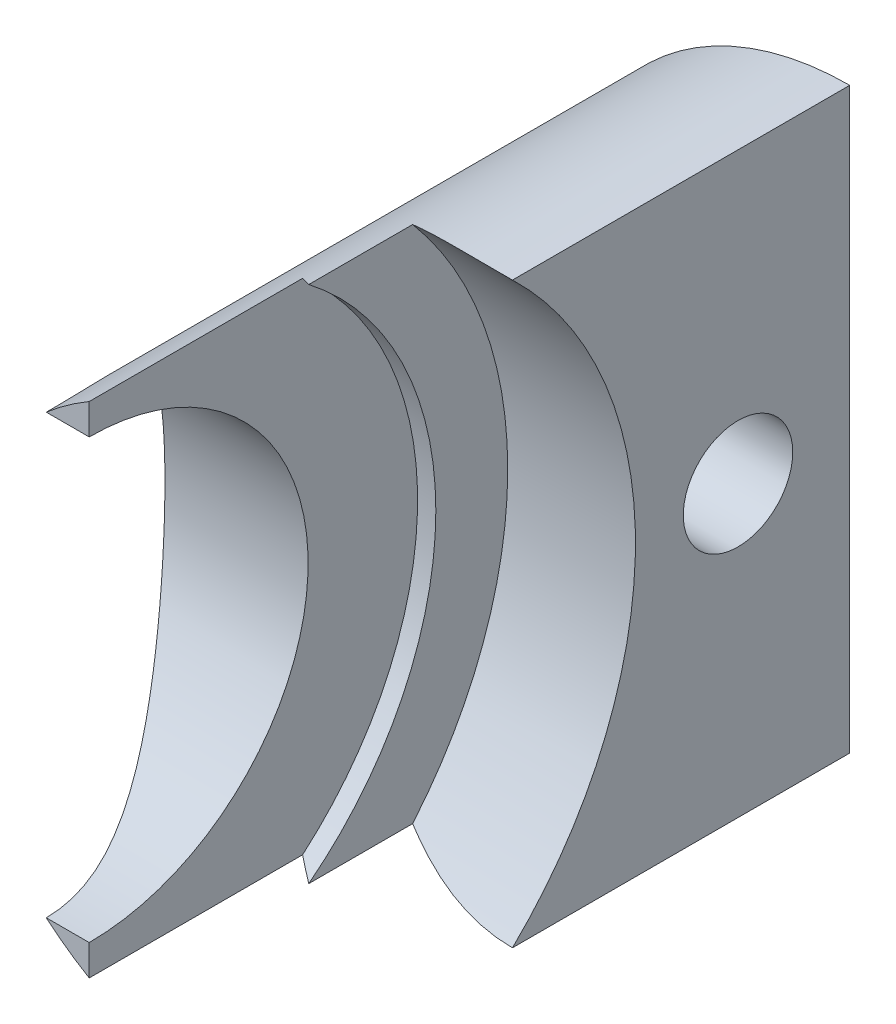
ISO-10303-21;
HEADER;
FILE_DESCRIPTION(('STEP AP214'),'2;1');
FILE_NAME('part.step','',(''),(''),'','','');
FILE_SCHEMA(('AUTOMOTIVE_DESIGN { 1 0 10303 214 1 1 1 1 }'));
ENDSEC;
DATA;
#1=APPLICATION_CONTEXT('core data for automotive mechanical design processes');
#2=APPLICATION_PROTOCOL_DEFINITION('international standard','automotive_design',2000,#1);
#3=PRODUCT_CONTEXT('',#1,'mechanical');
#4=PRODUCT('Part','Part','',(#3));
#5=PRODUCT_RELATED_PRODUCT_CATEGORY('part','',(#4));
#6=PRODUCT_DEFINITION_FORMATION('','',#4);
#7=PRODUCT_DEFINITION_CONTEXT('part definition',#1,'design');
#8=PRODUCT_DEFINITION('design','',#6,#7);
#9=PRODUCT_DEFINITION_SHAPE('','',#8);
#10=(LENGTH_UNIT() NAMED_UNIT(*) SI_UNIT(.MILLI.,.METRE.));
#11=(NAMED_UNIT(*) PLANE_ANGLE_UNIT() SI_UNIT($,.RADIAN.));
#12=(NAMED_UNIT(*) SI_UNIT($,.STERADIAN.) SOLID_ANGLE_UNIT());
#13=UNCERTAINTY_MEASURE_WITH_UNIT(LENGTH_MEASURE(1.E-05),#10,'distance_accuracy_value','');
#14=(GEOMETRIC_REPRESENTATION_CONTEXT(3) GLOBAL_UNCERTAINTY_ASSIGNED_CONTEXT((#13)) GLOBAL_UNIT_ASSIGNED_CONTEXT((#10,
#11,#12)) REPRESENTATION_CONTEXT('',''));
#15=CARTESIAN_POINT('',(0.,0.,0.));
#16=DIRECTION('',(0.,0.,1.));
#17=DIRECTION('',(1.,0.,0.));
#18=AXIS2_PLACEMENT_3D('',#15,#16,#17);
#19=CARTESIAN_POINT('',(0.,0.,16.84375));
#20=DIRECTION('',(0.,0.,1.));
#21=DIRECTION('',(1.,0.,0.));
#22=AXIS2_PLACEMENT_3D('',#19,#20,#21);
#23=PLANE('',#22);
#24=DIRECTION('',(1.,0.,0.));
#25=VECTOR('',#24,1.);
#26=CARTESIAN_POINT('',(-7.925,-6.,16.84375));
#27=LINE('',#26,#25);
#28=CARTESIAN_POINT('',(-5.17741489548597,-6.,16.84375));
#29=VERTEX_POINT('',#28);
#30=CARTESIAN_POINT('',(-4.,-6.,16.84375));
#31=VERTEX_POINT('',#30);
#32=EDGE_CURVE('E100',#29,#31,#27,.T.);
#33=ORIENTED_EDGE('',*,*,#32,.F.);
#34=CARTESIAN_POINT('',(0.,0.,16.84375));
#35=DIRECTION('',(0.,0.,1.));
#36=DIRECTION('',(1.,0.,0.));
#37=AXIS2_PLACEMENT_3D('',#34,#35,#36);
#38=CIRCLE('',#37,7.925);
#39=CARTESIAN_POINT('',(-4.,-6.84146365918873,16.84375));
#40=VERTEX_POINT('',#39);
#41=EDGE_CURVE('E111',#29,#40,#38,.T.);
#42=ORIENTED_EDGE('',*,*,#41,.T.);
#43=DIRECTION('',(0.,1.,0.));
#44=VECTOR('',#43,1.);
#45=CARTESIAN_POINT('',(-4.,0.,16.84375));
#46=LINE('',#45,#44);
#47=EDGE_CURVE('E113',#40,#31,#46,.T.);
#48=ORIENTED_EDGE('',*,*,#47,.T.);
#49=EDGE_LOOP('',(#33,#42,#48));
#50=FACE_BOUND('',#49,.T.);
#51=ADVANCED_FACE('F29',(#50),#23,.T.);
#52=DIRECTION('',(1.,0.,0.));
#53=VECTOR('',#52,1.);
#54=CARTESIAN_POINT('',(-7.925,6.,16.84375));
#55=LINE('',#54,#53);
#56=CARTESIAN_POINT('',(-4.,6.,16.84375));
#57=VERTEX_POINT('',#56);
#58=CARTESIAN_POINT('',(-5.17741489548597,6.,16.84375));
#59=VERTEX_POINT('',#58);
#60=EDGE_CURVE('E103',#57,#59,#55,.F.);
#61=ORIENTED_EDGE('',*,*,#60,.F.);
#62=CARTESIAN_POINT('',(-4.,6.84146365918873,16.84375));
#63=VERTEX_POINT('',#62);
#64=EDGE_CURVE('E182',#57,#63,#46,.T.);
#65=ORIENTED_EDGE('',*,*,#64,.T.);
#66=EDGE_CURVE('E117',#63,#59,#38,.T.);
#67=ORIENTED_EDGE('',*,*,#66,.T.);
#68=EDGE_LOOP('',(#61,#65,#67));
#69=FACE_BOUND('',#68,.T.);
#70=ADVANCED_FACE('F206',(#69),#23,.T.);
#71=CARTESIAN_POINT('',(0.,0.,16.84375));
#72=DIRECTION('',(0.,0.,-1.));
#73=DIRECTION('',(-1.,0.,0.));
#74=AXIS2_PLACEMENT_3D('',#71,#72,#73);
#75=CYLINDRICAL_SURFACE('',#74,7.925);
#76=CARTESIAN_POINT('',(-7.925,0.,1.5625));
#77=CARTESIAN_POINT('',(-7.92499848371948,0.0834570395977829,1.56250317336691));
#78=CARTESIAN_POINT('',(-7.92366808859329,0.166955202672544,1.569488613297));
#79=CARTESIAN_POINT('',(-7.91848912344264,0.331597599956485,1.59722723564836));
#80=CARTESIAN_POINT('',(-7.91463844543031,0.41273980423412,1.61799194337844));
#81=CARTESIAN_POINT('',(-7.90484955579841,0.570265475447111,1.67262970705467));
#82=CARTESIAN_POINT('',(-7.89891324575618,0.646653202850343,1.70649082516074));
#83=CARTESIAN_POINT('',(-7.88560092752527,0.792656462406949,1.7863261099215));
#84=CARTESIAN_POINT('',(-7.87822503160065,0.862272522005299,1.83229933212873));
#85=CARTESIAN_POINT('',(-7.86274678235363,0.993611905934744,1.93564873711105));
#86=CARTESIAN_POINT('',(-7.85463737509997,1.05524073071637,1.99314396847609));
#87=CARTESIAN_POINT('',(-7.83865829437125,1.16803861203772,2.11764924864934));
#88=CARTESIAN_POINT('',(-7.83078863835487,1.21920690838369,2.18465998837499));
#89=CARTESIAN_POINT('',(-7.81611148057603,1.31002556993215,2.32696357924578));
#90=CARTESIAN_POINT('',(-7.80931307109212,1.34957956815894,2.4023189525069));
#91=CARTESIAN_POINT('',(-7.7976476449595,1.41542987431425,2.55875545566025));
#92=CARTESIAN_POINT('',(-7.79278045843732,1.44172734836295,2.63983608121074));
#93=CARTESIAN_POINT('',(-7.78559960520081,1.48001435057426,2.80440959467139));
#94=CARTESIAN_POINT('',(-7.78325652573322,1.49216882030728,2.88786280105138));
#95=CARTESIAN_POINT('',(-7.78130052045626,1.5023368114327,3.0556543575816));
#96=CARTESIAN_POINT('',(-7.78168734509969,1.50035162536534,3.1399926261224));
#97=CARTESIAN_POINT('',(-7.78512067069891,1.48243034962562,3.30596364573442));
#98=CARTESIAN_POINT('',(-7.78813137294877,1.46668202838643,3.38761752180427));
#99=CARTESIAN_POINT('',(-7.79641697404718,1.42197732018187,3.54710290402796));
#100=CARTESIAN_POINT('',(-7.80169197076541,1.39302036229574,3.62493424479815));
#101=CARTESIAN_POINT('',(-7.81394911022026,1.32253733306208,3.77511346618336));
#102=CARTESIAN_POINT('',(-7.82094147446446,1.28093563638314,3.84742498514177));
#103=CARTESIAN_POINT('',(-7.83583875379596,1.18639751632359,3.98411159924889));
#104=CARTESIAN_POINT('',(-7.8437437631594,1.13345992146228,4.04848587305811));
#105=CARTESIAN_POINT('',(-7.85973149746342,1.01674131650945,4.16855532872357));
#106=CARTESIAN_POINT('',(-7.86781503708303,0.952799749716239,4.22409444394866));
#107=CARTESIAN_POINT('',(-7.88313235527213,0.816425008558438,4.32368159908748));
#108=CARTESIAN_POINT('',(-7.89036612501102,0.743991745965808,4.36772951959327));
#109=CARTESIAN_POINT('',(-7.90318387876219,0.59252547032848,4.44310773156422));
#110=CARTESIAN_POINT('',(-7.9087657257274,0.513484076496507,4.47442156870695));
#111=CARTESIAN_POINT('',(-7.91763423900561,0.351133850096447,4.52328374883041));
#112=CARTESIAN_POINT('',(-7.92092115384422,0.267825480662051,4.54083358238499));
#113=CARTESIAN_POINT('',(-7.92479525353875,0.100648603971151,4.56145183587511));
#114=CARTESIAN_POINT('',(-7.9254222930723,0.0168073588889621,4.56473405559083));
#115=CARTESIAN_POINT('',(-7.92401616684636,-0.150225893266153,4.55729772514609));
#116=CARTESIAN_POINT('',(-7.92198313437726,-0.23341793265924,4.54657987649854));
#117=CARTESIAN_POINT('',(-7.91551013384104,-0.39611151113508,4.51162538443318));
#118=CARTESIAN_POINT('',(-7.91108947226885,-0.475637173331645,4.48749713338365));
#119=CARTESIAN_POINT('',(-7.90033487933066,-0.629514388963665,4.42652420474412));
#120=CARTESIAN_POINT('',(-7.89400081614994,-0.703865585494564,4.38967865103103));
#121=CARTESIAN_POINT('',(-7.88002261530286,-0.846194267061441,4.30384530261995));
#122=CARTESIAN_POINT('',(-7.87236470232106,-0.91409174763786,4.2547271341029));
#123=CARTESIAN_POINT('',(-7.85662335616311,-1.04075726435733,4.14591900283076));
#124=CARTESIAN_POINT('',(-7.84853988249625,-1.0995244296714,4.08622803282614));
#125=CARTESIAN_POINT('',(-7.83272595988502,-1.20707530089407,3.95700003853142));
#126=CARTESIAN_POINT('',(-7.82500177669041,-1.25571297919608,3.88734058667665));
#127=CARTESIAN_POINT('',(-7.81090801252659,-1.34059691554051,3.74071461209814));
#128=CARTESIAN_POINT('',(-7.80453838063785,-1.37684363940793,3.66374836420479));
#129=CARTESIAN_POINT('',(-7.79392428679271,-1.43571078202909,3.50506091402016));
#130=CARTESIAN_POINT('',(-7.78966948499935,-1.45839761048839,3.42336507127201));
#131=CARTESIAN_POINT('',(-7.78374340795502,-1.48970531945365,3.25723290828082));
#132=CARTESIAN_POINT('',(-7.78207183502654,-1.498327820664,3.17279690494434));
#133=CARTESIAN_POINT('',(-7.78151677430078,-1.50120708268881,3.0050444351122));
#134=CARTESIAN_POINT('',(-7.78258857056606,-1.4956942419548,2.92173198420293));
#135=CARTESIAN_POINT('',(-7.78730022630365,-1.47096429407233,2.75724432738762));
#136=CARTESIAN_POINT('',(-7.7909400697357,-1.45174727252152,2.67606910813552));
#137=CARTESIAN_POINT('',(-7.800358708229,-1.40025245426932,2.51828725434834));
#138=CARTESIAN_POINT('',(-7.80613334053562,-1.36800006468281,2.44167206327842));
#139=CARTESIAN_POINT('',(-7.8191737643007,-1.29137540467831,2.29490360923344));
#140=CARTESIAN_POINT('',(-7.82643966385813,-1.24700225557352,2.22475081523901));
#141=CARTESIAN_POINT('',(-7.84178246925031,-1.14659661646438,2.09174537552434));
#142=CARTESIAN_POINT('',(-7.84987005399919,-1.09039662628069,2.02902038549518));
#143=CARTESIAN_POINT('',(-7.86586552302267,-0.968281413042159,1.91381446708884));
#144=CARTESIAN_POINT('',(-7.87377336559303,-0.902363961347241,1.8613358950994));
#145=CARTESIAN_POINT('',(-7.88860376027912,-0.761958024020439,1.76766070972676));
#146=CARTESIAN_POINT('',(-7.89551657723058,-0.68739625650139,1.72657234484605));
#147=CARTESIAN_POINT('',(-7.90748287021571,-0.532320313335581,1.65757167407056));
#148=CARTESIAN_POINT('',(-7.91253808199661,-0.451811779284627,1.62964706102112));
#149=CARTESIAN_POINT('',(-7.91919564162046,-0.309228461225967,1.59340037484214));
#150=CARTESIAN_POINT('',(-7.92135992219509,-0.247984316003027,1.58183265565595));
#151=CARTESIAN_POINT('',(-7.92426264826391,-0.124501059104401,1.56638138540379));
#152=CARTESIAN_POINT('',(-7.92500113120017,-0.0622619735995683,1.56249763255338));
#153=CARTESIAN_POINT('',(-7.925,0.,1.5625));
#154=B_SPLINE_CURVE_WITH_KNOTS('',3,(#76,#77,#78,#79,#80,#81,#82,#83,#84,#85,#86,#87,#88,#89,
#90,#91,#92,#93,#94,#95,#96,#97,#98,#99,#100,#101,#102,#103,#104,#105,#106,#107,#108,#109,#110,
#111,#112,#113,#114,#115,#116,#117,#118,#119,#120,#121,#122,#123,#124,#125,#126,#127,#128,#129,
#130,#131,#132,#133,#134,#135,#136,#137,#138,#139,#140,#141,#142,#143,#144,#145,#146,#147,#148,
#149,#150,#151,#152,#153),.UNSPECIFIED.,.T.,.F.,(4,2,2,2,2,2,2,2,2,2,2,2,2,2,2,2,2,2,2,2,2,2,2,
2,2,2,2,2,2,2,2,2,2,2,2,2,2,2,4),(0.,0.250143412147268,0.500496314385551,0.750621546920509,
1.000727281583,1.25356442104396,1.50641992830943,1.76131771944112,2.01619308438141,
2.26806521265155,2.5199143169749,2.76838019331623,3.01685681018847,3.26684976961555,
3.5168685764329,3.77090447122562,4.02494300566498,4.27930876041063,4.53364696479179,
4.78416048544787,5.03466145389883,5.28316653775695,5.53168874509808,5.78297250484537,
6.03428021677975,6.2889923217932,6.54369485011736,6.79713952595101,7.05055499399412,
7.29986627658862,7.54917600197427,7.79800212559833,8.04684629250405,8.29948568937352,
8.55218311793758,8.80720562481341,9.06198922891165,9.2486101731229,9.43522621651815),.UNSPECIFIED.);
#155=CARTESIAN_POINT('',(-7.925,0.,1.5625));
#156=VERTEX_POINT('',#155);
#157=EDGE_CURVE('E11',#156,#156,#154,.T.);
#158=ORIENTED_EDGE('',*,*,#157,.T.);
#159=EDGE_LOOP('',(#158));
#160=FACE_BOUND('',#159,.T.);
#161=CARTESIAN_POINT('',(-7.925,0.,10.84375));
#162=CARTESIAN_POINT('',(-7.92499899481269,0.146212432176672,10.8437510392425));
#163=CARTESIAN_POINT('',(-7.92094449525753,0.29244353635906,10.8491035137385));
#164=CARTESIAN_POINT('',(-7.90481915130532,0.583744238644911,10.8704269426969));
#165=CARTESIAN_POINT('',(-7.8927442517974,0.728813211605733,10.8864032685788));
#166=CARTESIAN_POINT('',(-7.86083756414329,1.01679845257287,10.9287406046531));
#167=CARTESIAN_POINT('',(-7.84099333420846,1.15971088395263,10.9551182720193));
#168=CARTESIAN_POINT('',(-7.79399266974542,1.44215626599521,11.0178485600288));
#169=CARTESIAN_POINT('',(-7.76683299759491,1.58168769043938,11.0542055974148));
#170=CARTESIAN_POINT('',(-7.70598317272289,1.85552930180877,11.1360973417115));
#171=CARTESIAN_POINT('',(-7.67233661361313,1.98986753058115,11.1815708605007));
#172=CARTESIAN_POINT('',(-7.59905901093454,2.25359517132646,11.2812677051227));
#173=CARTESIAN_POINT('',(-7.55942559833166,2.38298259872181,11.3354944952634));
#174=CARTESIAN_POINT('',(-7.43265853060988,2.7626491920796,11.5103385087745));
#175=CARTESIAN_POINT('',(-7.33758201017941,3.00476294726396,11.6432200460662));
#176=CARTESIAN_POINT('',(-7.12278983574419,3.48528497800126,11.9507199079938));
#177=CARTESIAN_POINT('',(-7.0016048497734,3.72125313403848,12.1280709739185));
#178=CARTESIAN_POINT('',(-6.74882228813606,4.16216321872433,12.5122335018914));
#179=CARTESIAN_POINT('',(-6.61720917639743,4.36705747733808,12.7190893020907));
#180=CARTESIAN_POINT('',(-6.40471920089757,4.66954251566286,13.0720151936766));
#181=CARTESIAN_POINT('',(-6.32439535234777,4.7774890945105,13.2097074807218));
#182=CARTESIAN_POINT('',(-6.1651031326346,4.98134933980292,13.4945932224569));
#183=CARTESIAN_POINT('',(-6.08613518281029,5.07725932232283,13.6417895651867));
#184=CARTESIAN_POINT('',(-5.93203738363489,5.25647321605696,13.9453848799959));
#185=CARTESIAN_POINT('',(-5.85690398536857,5.33978892886411,14.1017750435932));
#186=CARTESIAN_POINT('',(-5.71327882238849,5.49318710771459,14.4236875521104));
#187=CARTESIAN_POINT('',(-5.64478327321033,5.56327713602124,14.5892046080043));
#188=CARTESIAN_POINT('',(-5.49843467029975,5.70845446543018,14.9811319619207));
#189=CARTESIAN_POINT('',(-5.42404423035331,5.77861005357518,15.210785390982));
#190=CARTESIAN_POINT('',(-5.33180888489028,5.86337679568907,15.564865776066));
#191=CARTESIAN_POINT('',(-5.30429920404094,5.88821276604748,15.6844203189889));
#192=CARTESIAN_POINT('',(-5.25675052783906,5.93070125228707,15.9262379804264));
#193=CARTESIAN_POINT('',(-5.23670763891036,5.94835751248583,16.0484996519648));
#194=CARTESIAN_POINT('',(-5.20482496777558,5.97627652716172,16.2962030615035));
#195=CARTESIAN_POINT('',(-5.19306971685826,5.98646313444097,16.4216644159454));
#196=CARTESIAN_POINT('',(-5.1786878359464,5.99890900363272,16.6735056826527));
#197=CARTESIAN_POINT('',(-5.17606090368512,6.00116852803536,16.799885564364));
#198=CARTESIAN_POINT('',(-5.18008033848026,5.9976996924785,17.0524216719978));
#199=CARTESIAN_POINT('',(-5.18672903147412,5.99196932899072,17.1785778338772));
#200=CARTESIAN_POINT('',(-5.20893826284979,5.97267030311227,17.4294646553111));
#201=CARTESIAN_POINT('',(-5.22449886764502,5.95910158230852,17.5541953042352));
#202=CARTESIAN_POINT('',(-5.27898408770539,5.91102077971448,17.8966469023387));
#203=CARTESIAN_POINT('',(-5.32667237389937,5.86842716719813,18.111899587204));
#204=CARTESIAN_POINT('',(-5.441780361657,5.76183187889354,18.5314547543362));
#205=CARTESIAN_POINT('',(-5.5092198368143,5.69780874004888,18.7357460190578));
#206=CARTESIAN_POINT('',(-5.64412115484242,5.56388900392467,19.0961031017846));
#207=CARTESIAN_POINT('',(-5.70937128428847,5.49715092005485,19.2542067496076));
#208=CARTESIAN_POINT('',(-5.8460099704438,5.35161233027176,19.5620685382515));
#209=CARTESIAN_POINT('',(-5.91740176031911,5.27280545371955,19.7118222141677));
#210=CARTESIAN_POINT('',(-6.06395404771754,5.1035914681215,20.0031471593549));
#211=CARTESIAN_POINT('',(-6.13912215559084,5.01316031070733,20.1447005574627));
#212=CARTESIAN_POINT('',(-6.29096895725739,4.821235193379,20.4191840355825));
#213=CARTESIAN_POINT('',(-6.36764740624485,4.71974301441247,20.5521154983403));
#214=CARTESIAN_POINT('',(-6.52282751683749,4.50295560253556,20.8127441918757));
#215=CARTESIAN_POINT('',(-6.60132048641276,4.38735469093615,20.9401925706264));
#216=CARTESIAN_POINT('',(-6.75618919498242,4.14490380919898,21.1853501459268));
#217=CARTESIAN_POINT('',(-6.83256471862963,4.01805270036928,21.3030583542863));
#218=CARTESIAN_POINT('',(-6.98135843603287,3.75356406483407,21.5278530966769));
#219=CARTESIAN_POINT('',(-7.05378358774148,3.6159466158793,21.6349585960804));
#220=CARTESIAN_POINT('',(-7.19319114410678,3.33000263447645,21.8379279067686));
#221=CARTESIAN_POINT('',(-7.26017309035326,3.18167520204863,21.9337907715336));
#222=CARTESIAN_POINT('',(-7.37468805783501,2.90473420108697,22.0957020658754));
#223=CARTESIAN_POINT('',(-7.42346908606233,2.77790251978334,22.1639219076508));
#224=CARTESIAN_POINT('',(-7.51558171990335,2.5180639661874,22.2917134454554));
#225=CARTESIAN_POINT('',(-7.55891444065152,2.38505836519996,22.3512869115714));
#226=CARTESIAN_POINT('',(-7.63931171783092,2.11343267499001,22.461121104368));
#227=CARTESIAN_POINT('',(-7.67637713361616,1.97481335873931,22.511383107899));
#228=CARTESIAN_POINT('',(-7.7434646484377,1.69274433321996,22.6019219220858));
#229=CARTESIAN_POINT('',(-7.77348965099585,1.54929664322063,22.6422028494063));
#230=CARTESIAN_POINT('',(-7.82601652335409,1.25746449249756,22.712434456569));
#231=CARTESIAN_POINT('',(-7.84846574174909,1.10905305497235,22.7423128831069));
#232=CARTESIAN_POINT('',(-7.88500531278396,0.809380831353049,22.7908450312436));
#233=CARTESIAN_POINT('',(-7.89909564011314,0.658120036632553,22.809498718854));
#234=CARTESIAN_POINT('',(-7.91854891979862,0.354115409458515,22.8352325415861));
#235=CARTESIAN_POINT('',(-7.92391529113694,0.201372181602081,22.8423172106953));
#236=CARTESIAN_POINT('',(-7.92578717943744,-0.104255781384281,22.8447897997707));
#237=CARTESIAN_POINT('',(-7.92229346915423,-0.257140503010893,22.8401787398096));
#238=CARTESIAN_POINT('',(-7.90738303844909,-0.545419725564033,22.8204645141135));
#239=CARTESIAN_POINT('',(-7.89684995246734,-0.680942517590977,22.8065313319107));
#240=CARTESIAN_POINT('',(-7.86900692142248,-0.950086922505433,22.7696079076288));
#241=CARTESIAN_POINT('',(-7.8516947304195,-1.08370789009193,22.7466146639056));
#242=CARTESIAN_POINT('',(-7.81064171811268,-1.34810562666249,22.6918973361403));
#243=CARTESIAN_POINT('',(-7.78690253329708,-1.47888311053015,22.6601754746093));
#244=CARTESIAN_POINT('',(-7.73344594131474,-1.73690345773873,22.5884108397684));
#245=CARTESIAN_POINT('',(-7.70372621632235,-1.86414492883092,22.5483648401462));
#246=CARTESIAN_POINT('',(-7.6045082938804,-2.24668517496423,22.4139113046216));
#247=CARTESIAN_POINT('',(-7.52614008181644,-2.49535447195071,22.3067475159632));
#248=CARTESIAN_POINT('',(-7.35144351740231,-2.97090625298339,22.0634484804145));
#249=CARTESIAN_POINT('',(-7.2551125338625,-3.19778553783924,21.9273089887448));
#250=CARTESIAN_POINT('',(-7.03287532991096,-3.66351405283314,21.6052116818141));
#251=CARTESIAN_POINT('',(-6.9047120300641,-3.89815520761558,21.4147397502093));
#252=CARTESIAN_POINT('',(-6.63958363769059,-4.3343750876033,21.0034787654097));
#253=CARTESIAN_POINT('',(-6.5026006576457,-4.53588347484724,20.7826269971338));
#254=CARTESIAN_POINT('',(-6.28439601478995,-4.83020428097959,20.4075907764978));
#255=CARTESIAN_POINT('',(-6.20285319074085,-4.93418916850401,20.2622106723827));
#256=CARTESIAN_POINT('',(-6.0423961911567,-5.12942686029539,19.9616210541463));
#257=CARTESIAN_POINT('',(-5.96348297398184,-5.22067506048874,19.8064080149276));
#258=CARTESIAN_POINT('',(-5.81123881721634,-5.3896230868554,19.4865869165318));
#259=CARTESIAN_POINT('',(-5.73789707571434,-5.46734952716499,19.3219981789054));
#260=CARTESIAN_POINT('',(-5.59999634676145,-5.60851038353973,18.9834372039257));
#261=CARTESIAN_POINT('',(-5.535430560197,-5.67195588895653,18.8094723782608));
#262=CARTESIAN_POINT('',(-5.405635661066,-5.7960835859088,18.4115560515913));
#263=CARTESIAN_POINT('',(-5.34360510706987,-5.85284484985838,18.1852442619838));
#264=CARTESIAN_POINT('',(-5.27082671396687,-5.91819721616069,17.8381465099172));
#265=CARTESIAN_POINT('',(-5.24995164571082,-5.93667789321698,17.7212483442045));
#266=CARTESIAN_POINT('',(-5.21573575778472,-5.96676224748073,17.4854991140086));
#267=CARTESIAN_POINT('',(-5.20239143509855,-5.97836912224362,17.3666489840256));
#268=CARTESIAN_POINT('',(-5.18377214105311,-5.99452134756041,17.1270113649706));
#269=CARTESIAN_POINT('',(-5.17855318171514,-5.99901768508759,17.0062161776045));
#270=CARTESIAN_POINT('',(-5.17661105397642,-6.00069371442804,16.7645083887675));
#271=CARTESIAN_POINT('',(-5.17988762956666,-5.99787362671839,16.6435957909443));
#272=CARTESIAN_POINT('',(-5.19478259403108,-5.98497735911785,16.4025912885636));
#273=CARTESIAN_POINT('',(-5.20640724380084,-5.97489573319561,16.2825000683062));
#274=CARTESIAN_POINT('',(-5.23746926640349,-5.94768550809519,16.0440970860216));
#275=CARTESIAN_POINT('',(-5.25691069923678,-5.93055324674095,15.9257862819142));
#276=CARTESIAN_POINT('',(-5.30688169287328,-5.88591069775508,15.670870095686));
#277=CARTESIAN_POINT('',(-5.33876952495857,-5.85709535786992,15.5347600833922));
#278=CARTESIAN_POINT('',(-5.41069363211362,-5.79071739112431,15.2668330930014));
#279=CARTESIAN_POINT('',(-5.45073588255679,-5.75314834682003,15.1350193457525));
#280=CARTESIAN_POINT('',(-5.53740951627593,-5.66977425173791,14.8759552030021));
#281=CARTESIAN_POINT('',(-5.5840541828716,-5.62395254562959,14.7487146717473));
#282=CARTESIAN_POINT('',(-5.68232321786444,-5.52464558458057,14.4993304370178));
#283=CARTESIAN_POINT('',(-5.73394617280296,-5.47116250281182,14.3771853008625));
#284=CARTESIAN_POINT('',(-5.86106365354823,-5.33527605991007,14.0927090342411));
#285=CARTESIAN_POINT('',(-5.93819642300523,-5.24958963991127,13.932671534822));
#286=CARTESIAN_POINT('',(-6.09632950851804,-5.06509337154247,13.622348185277));
#287=CARTESIAN_POINT('',(-6.17733115601933,-4.96627898413255,13.472065734867));
#288=CARTESIAN_POINT('',(-6.3407294586971,-4.75589456216246,13.1812789106515));
#289=CARTESIAN_POINT('',(-6.42312729439166,-4.64431322193764,13.0407833834564));
#290=CARTESIAN_POINT('',(-6.58703166057371,-4.40876713605805,12.7700589476214));
#291=CARTESIAN_POINT('',(-6.66853830501721,-4.28480399469578,12.6398287128241));
#292=CARTESIAN_POINT('',(-6.82969281824459,-4.02303930931371,12.3885867622747));
#293=CARTESIAN_POINT('',(-6.909303725354,-3.88508144389979,12.2677137925595));
#294=CARTESIAN_POINT('',(-7.06360151375825,-3.59692491667387,12.0379110847053));
#295=CARTESIAN_POINT('',(-7.13828773816382,-3.4467246278311,11.9289829385723));
#296=CARTESIAN_POINT('',(-7.28063803201542,-3.13484659303602,11.7244291407971));
#297=CARTESIAN_POINT('',(-7.34831533926996,-2.97319149225993,11.6287782913929));
#298=CARTESIAN_POINT('',(-7.47486227745726,-2.63892979831762,11.4519269685838));
#299=CARTESIAN_POINT('',(-7.53373621978752,-2.46632862530245,11.3707194179399));
#300=CARTESIAN_POINT('',(-7.62536119048043,-2.16261423392142,11.2453783257332));
#301=CARTESIAN_POINT('',(-7.66074757474312,-2.03390434120457,11.1973091344127));
#302=CARTESIAN_POINT('',(-7.72549920218947,-1.77213167099676,11.1097651319142));
#303=CARTESIAN_POINT('',(-7.75486588706746,-1.63906994462563,11.0702882627687));
#304=CARTESIAN_POINT('',(-7.80695984173417,-1.3695975448907,11.0005030804154));
#305=CARTESIAN_POINT('',(-7.82970104119055,-1.23319456097485,10.9701755265078));
#306=CARTESIAN_POINT('',(-7.86815016352689,-0.957688266926618,10.9190181355276));
#307=CARTESIAN_POINT('',(-7.88386113798027,-0.818586155800577,10.8981841775468));
#308=CARTESIAN_POINT('',(-7.90554693594901,-0.56628114159497,10.8694621108213));
#309=CARTESIAN_POINT('',(-7.91283134775331,-0.453385090718213,10.8598304864472));
#310=CARTESIAN_POINT('',(-7.92255879132092,-0.226996526145592,10.8469733377672));
#311=CARTESIAN_POINT('',(-7.92500078032126,-0.113503889255861,10.8437491932419));
#312=CARTESIAN_POINT('',(-7.925,0.,10.84375));
#313=B_SPLINE_CURVE_WITH_KNOTS('',3,(#161,#162,#163,#164,#165,#166,#167,#168,#169,#170,#171,
#172,#173,#174,#175,#176,#177,#178,#179,#180,#181,#182,#183,#184,#185,#186,#187,#188,#189,#190,
#191,#192,#193,#194,#195,#196,#197,#198,#199,#200,#201,#202,#203,#204,#205,#206,#207,#208,#209,
#210,#211,#212,#213,#214,#215,#216,#217,#218,#219,#220,#221,#222,#223,#224,#225,#226,#227,#228,
#229,#230,#231,#232,#233,#234,#235,#236,#237,#238,#239,#240,#241,#242,#243,#244,#245,#246,#247,
#248,#249,#250,#251,#252,#253,#254,#255,#256,#257,#258,#259,#260,#261,#262,#263,#264,#265,#266,
#267,#268,#269,#270,#271,#272,#273,#274,#275,#276,#277,#278,#279,#280,#281,#282,#283,#284,#285,
#286,#287,#288,#289,#290,#291,#292,#293,#294,#295,#296,#297,#298,#299,#300,#301,#302,#303,#304,
#305,#306,#307,#308,#309,#310,#311,#312),.UNSPECIFIED.,.T.,.F.,(4,2,2,2,2,2,2,2,2,2,2,2,2,2,2,2,
2,2,2,2,2,2,2,2,2,2,2,2,2,2,2,2,2,2,2,2,2,2,2,2,2,2,2,2,2,2,2,2,2,2,2,2,2,2,2,2,2,2,2,2,2,2,2,2,
2,2,2,2,2,2,2,2,2,2,2,4),(0.,0.438517023153937,0.877255929270567,1.31670032375888,
1.75633952525423,2.19312120019453,2.6300761672507,3.50293707887262,4.45700034251564,
5.41251273002673,5.98954351501543,6.5667504777669,7.14341316428988,7.71974511724753,
8.47087458394447,8.84600337628911,9.22093628213084,9.59964012526847,9.97833142823605,
10.357117708156,10.7359068109066,11.4068138786043,12.078394923886,12.6284670752911,
13.1788305953038,13.7303516084991,14.2817839514989,14.8485725522498,15.4154185862849,
15.9812316357703,16.5470922870329,17.002819043943,17.4584523724309,17.9140231750958,
18.3694057650284,18.8278910276463,19.2863776785483,19.7446846018305,20.2029515540815,
20.6124021139493,21.021988441067,21.431470574243,21.8411117135379,22.6832361675824,
23.5254840731916,24.5067875831105,25.4901481438296,26.0789608153096,26.667985783352,
27.2558379562734,27.8432320665609,28.5644174386133,28.9245761631512,29.2845672171809,
29.6470290440307,30.009479948388,30.37220296824,30.7351146286009,31.1626739651332,
31.5905477421957,32.0192949230255,32.4479207283801,33.0388243771658,33.6299328672284,
34.2215689197765,34.8131284140729,35.4122321490184,36.0114156357054,36.6094459682669,
37.2071824528276,37.6324039162052,38.0575234214235,38.4817425807425,38.9057774223976,
39.2461224409842,39.586540741206),.UNSPECIFIED.);
#314=EDGE_CURVE('E41',#29,#59,#313,.T.);
#315=ORIENTED_EDGE('',*,*,#314,.T.);
#316=ORIENTED_EDGE('',*,*,#66,.F.);
#317=DIRECTION('',(0.,0.,-1.));
#318=VECTOR('',#317,1.);
#319=CARTESIAN_POINT('',(-4.,6.84146365918873,16.84375));
#320=LINE('',#319,#318);
#321=CARTESIAN_POINT('',(-4.,6.84146365918873,10.9961543402438));
#322=VERTEX_POINT('',#321);
#323=EDGE_CURVE('E154',#322,#63,#320,.F.);
#324=ORIENTED_EDGE('',*,*,#323,.F.);
#325=CARTESIAN_POINT('',(-4.,6.84146365918873,10.9961543402438));
#326=CARTESIAN_POINT('',(-3.8710375308379,6.91683585802271,11.0843079100545));
#327=CARTESIAN_POINT('',(-3.73968192012294,6.98877030195516,11.1719485258962));
#328=CARTESIAN_POINT('',(-3.47169431467644,7.1257099619526,11.3449898643057));
#329=CARTESIAN_POINT('',(-3.33505558927621,7.19070591372915,11.4303874801583));
#330=CARTESIAN_POINT('',(-3.05329813139729,7.31486013640419,11.599319174863));
#331=CARTESIAN_POINT('',(-2.90805921616113,7.37385937580257,11.682771475941));
#332=CARTESIAN_POINT('',(-2.61161391782818,7.48399068640011,11.8438087077917));
#333=CARTESIAN_POINT('',(-2.46041056390043,7.53512668808946,11.9213965600206));
#334=CARTESIAN_POINT('',(-2.06543508593223,7.65523996885638,12.1092398186067));
#335=CARTESIAN_POINT('',(-1.81688739321352,7.71835471135747,12.2137084807187));
#336=CARTESIAN_POINT('',(-1.43336981414385,7.79537400284123,12.3454432324662));
#337=CARTESIAN_POINT('',(-1.30435857987584,7.81804130063197,12.3850689928507));
#338=CARTESIAN_POINT('',(-1.0428230364425,7.85720155138219,12.4544503579904));
#339=CARTESIAN_POINT('',(-0.91030121853407,7.8736987635216,12.4842127697443));
#340=CARTESIAN_POINT('',(-0.649200770697978,7.89939554732054,12.5309465641994));
#341=CARTESIAN_POINT('',(-0.520757071312494,7.90891923379852,12.5484839191905));
#342=CARTESIAN_POINT('',(-0.261579471184321,7.92176150231718,12.5722462411869));
#343=CARTESIAN_POINT('',(-0.130835677162662,7.92503397577123,12.5783871392079));
#344=CARTESIAN_POINT('',(0.,7.925,12.5782635095748));
#345=B_SPLINE_CURVE_WITH_KNOTS('',3,(#325,#326,#327,#328,#329,#330,#331,#332,#333,#334,#335,
#336,#337,#338,#339,#340,#341,#342,#343,#344),.UNSPECIFIED.,.F.,.F.,(4,2,2,2,2,2,2,2,2,4),(0.,
0.520318571235694,1.04132340525585,1.57373905985674,2.10588771184019,2.93356034268161,
3.34368278148986,3.75352158996488,4.14283392149501,4.53500687499044),.UNSPECIFIED.);
#346=CARTESIAN_POINT('',(-3.5,7.11024788597416,11.3261078405264));
#347=VERTEX_POINT('',#346);
#348=EDGE_CURVE('E172',#322,#347,#345,.T.);
#349=ORIENTED_EDGE('',*,*,#348,.T.);
#350=DIRECTION('',(0.,0.,-1.));
#351=VECTOR('',#350,1.);
#352=CARTESIAN_POINT('',(-3.5,7.11024788597416,16.84375));
#353=LINE('',#352,#351);
#354=CARTESIAN_POINT('',(-3.5,7.11024788597416,8.47999143399277));
#355=VERTEX_POINT('',#354);
#356=EDGE_CURVE('E131',#355,#347,#353,.F.);
#357=ORIENTED_EDGE('',*,*,#356,.F.);
#358=CARTESIAN_POINT('',(-3.5,7.11024788597416,8.47999143399277));
#359=CARTESIAN_POINT('',(-3.3446296778348,7.18672378833649,8.54476911958082));
#360=CARTESIAN_POINT('',(-3.18595313717724,7.25850922571666,8.6073879770616));
#361=CARTESIAN_POINT('',(-2.86204471174049,7.39223212651783,8.72676240687647));
#362=CARTESIAN_POINT('',(-2.69680262045428,7.45415344235371,8.78350831305784));
#363=CARTESIAN_POINT('',(-2.36454979065137,7.56600741503053,8.88804163950102));
#364=CARTESIAN_POINT('',(-2.19768762087351,7.6162020392652,8.93601821068577));
#365=CARTESIAN_POINT('',(-1.85886631164026,7.70590193536661,9.02307502260624));
#366=CARTESIAN_POINT('',(-1.68690906849513,7.74541113009359,9.06215852734718));
#367=CARTESIAN_POINT('',(-1.39084982988821,7.80298768897235,9.119751653518));
#368=CARTESIAN_POINT('',(-1.26781574717591,7.8239338604331,9.14091858429086));
#369=CARTESIAN_POINT('',(-1.02007881343877,7.86007195696841,9.1776574677934));
#370=CARTESIAN_POINT('',(-0.895376142102233,7.87526449656277,9.19323001802481));
#371=CARTESIAN_POINT('',(-0.642591273749006,7.89994265057889,9.21861438155248));
#372=CARTESIAN_POINT('',(-0.514488140343063,7.90932364553675,9.22832051627273));
#373=CARTESIAN_POINT('',(-0.257594505132995,7.92186040512243,9.24132115527797));
#374=CARTESIAN_POINT('',(-0.128803706056938,7.92501321422822,9.2446126155347));
#375=CARTESIAN_POINT('',(0.,7.925,9.2445823957464));
#376=B_SPLINE_CURVE_WITH_KNOTS('',3,(#358,#359,#360,#361,#362,#363,#364,#365,#366,#367,#368,
#369,#370,#371,#372,#373,#374,#375),.UNSPECIFIED.,.F.,.F.,(4,2,2,2,2,2,2,2,4),(0.,
0.554697210506613,1.11029333168667,1.65194004206452,2.19338763105646,2.57290810062746,
2.95238802386769,3.33851465807195,3.7248244807558),.UNSPECIFIED.);
#377=CARTESIAN_POINT('',(0.,7.925,9.2445823957464));
#378=VERTEX_POINT('',#377);
#379=EDGE_CURVE('E120',#355,#378,#376,.T.);
#380=ORIENTED_EDGE('',*,*,#379,.T.);
#381=DIRECTION('',(0.,0.,1.));
#382=VECTOR('',#381,1.);
#383=CARTESIAN_POINT('',(0.,7.925,0.));
#384=LINE('',#383,#382);
#385=CARTESIAN_POINT('',(0.,7.925,0.));
#386=VERTEX_POINT('',#385);
#387=EDGE_CURVE('E188',#386,#378,#384,.T.);
#388=ORIENTED_EDGE('',*,*,#387,.F.);
#389=CARTESIAN_POINT('',(0.,0.,0.));
#390=DIRECTION('',(0.,0.,1.));
#391=DIRECTION('',(1.,0.,0.));
#392=AXIS2_PLACEMENT_3D('',#389,#390,#391);
#393=CIRCLE('',#392,7.925);
#394=CARTESIAN_POINT('',(0.,-7.925,0.));
#395=VERTEX_POINT('',#394);
#396=EDGE_CURVE('E118',#386,#395,#393,.T.);
#397=ORIENTED_EDGE('',*,*,#396,.T.);
#398=DIRECTION('',(0.,0.,1.));
#399=VECTOR('',#398,1.);
#400=CARTESIAN_POINT('',(0.,-7.925,0.));
#401=LINE('',#400,#399);
#402=CARTESIAN_POINT('',(0.,-7.925,9.2445823957464));
#403=VERTEX_POINT('',#402);
#404=EDGE_CURVE('E191',#395,#403,#401,.T.);
#405=ORIENTED_EDGE('',*,*,#404,.T.);
#406=CARTESIAN_POINT('',(0.,-7.925,9.2445823957464));
#407=CARTESIAN_POINT('',(-0.0922840670025632,-7.92500166520478,9.2445875645996));
#408=CARTESIAN_POINT('',(-0.184551697523259,-7.92338756357451,9.2429069146524));
#409=CARTESIAN_POINT('',(-0.368843991166695,-7.91694870850191,9.23622493516293));
#410=CARTESIAN_POINT('',(-0.460868681266848,-7.91212432802054,9.23122399136298));
#411=CARTESIAN_POINT('',(-0.735992361334712,-7.8928877102182,9.21133845131723));
#412=CARTESIAN_POINT('',(-0.918446902704304,-7.87371184805328,9.1915708105935));
#413=CARTESIAN_POINT('',(-1.27572520560316,-7.8236804350543,9.14062592739652));
#414=CARTESIAN_POINT('',(-1.45062807029244,-7.79310171572967,9.10971965511844));
#415=CARTESIAN_POINT('',(-1.79601997786856,-7.72082030452736,9.03783173456742));
#416=CARTESIAN_POINT('',(-1.96650846931639,-7.67911623016636,8.99684883417999));
#417=CARTESIAN_POINT('',(-2.25292376426779,-7.59902170285333,8.91968025653906));
#418=CARTESIAN_POINT('',(-2.3701763671405,-7.56325201895691,8.88561771254225));
#419=CARTESIAN_POINT('',(-2.60186805305656,-7.48670725961084,8.81382779995086));
#420=CARTESIAN_POINT('',(-2.71630765546689,-7.4459331165986,8.77610111433652));
#421=CARTESIAN_POINT('',(-2.94416069912278,-7.35884997334453,8.69686943405601));
#422=CARTESIAN_POINT('',(-3.05752429789647,-7.31245923662192,8.65531145571157));
#423=CARTESIAN_POINT('',(-3.28112438753171,-7.21489540373504,8.56952179374578));
#424=CARTESIAN_POINT('',(-3.39136124604611,-7.16372287289473,8.52529042640162));
#425=CARTESIAN_POINT('',(-3.5,-7.11024788597416,8.47999143399277));
#426=B_SPLINE_CURVE_WITH_KNOTS('',3,(#406,#407,#408,#409,#410,#411,#412,#413,#414,#415,#416,
#417,#418,#419,#420,#421,#422,#423,#424,#425),.UNSPECIFIED.,.F.,.F.,(4,2,2,2,2,2,2,2,2,4),(0.,
0.27679084977297,0.553549548394885,1.10615326434793,1.64613269322398,2.18617925349155,
2.56770086773195,2.94915150396842,3.33703424425274,3.72487118527409),.UNSPECIFIED.);
#427=CARTESIAN_POINT('',(-3.5,-7.11024788597416,8.47999143399277));
#428=VERTEX_POINT('',#427);
#429=EDGE_CURVE('E144',#403,#428,#426,.T.);
#430=ORIENTED_EDGE('',*,*,#429,.T.);
#431=DIRECTION('',(0.,0.,-1.));
#432=VECTOR('',#431,1.);
#433=CARTESIAN_POINT('',(-3.5,-7.11024788597416,16.84375));
#434=LINE('',#433,#432);
#435=CARTESIAN_POINT('',(-3.5,-7.11024788597416,11.3261078405264));
#436=VERTEX_POINT('',#435);
#437=EDGE_CURVE('E150',#436,#428,#434,.T.);
#438=ORIENTED_EDGE('',*,*,#437,.F.);
#439=CARTESIAN_POINT('',(0.,-7.925,12.5782635095748));
#440=CARTESIAN_POINT('',(-0.127225522939726,-7.9250313627186,12.5783763116475));
#441=CARTESIAN_POINT('',(-0.254375373469212,-7.92193784531799,12.5725740252253));
#442=CARTESIAN_POINT('',(-0.507119674414117,-7.90975903243337,12.5500340667349));
#443=CARTESIAN_POINT('',(-0.632717103769197,-7.90068799793727,12.5333224227832));
#444=CARTESIAN_POINT('',(-0.879724720788446,-7.87698679115225,12.4901727514072));
#445=CARTESIAN_POINT('',(-1.00116937490064,-7.86244095739415,12.4638824689253));
#446=CARTESIAN_POINT('',(-1.24121300142793,-7.82813651064586,12.4028591323285));
#447=CARTESIAN_POINT('',(-1.35981006352655,-7.80837449939256,12.3681205754512));
#448=CARTESIAN_POINT('',(-1.64771234742609,-7.75376959406761,12.2739344845237));
#449=CARTESIAN_POINT('',(-1.81518322755525,-7.71617460023344,12.2104795886377));
#450=CARTESIAN_POINT('',(-2.14303382917544,-7.63162712418413,12.0725011664779));
#451=CARTESIAN_POINT('',(-2.30340937722578,-7.58466922186313,11.9979712353587));
#452=CARTESIAN_POINT('',(-2.61854246366497,-7.48174679240173,11.8405131284913));
#453=CARTESIAN_POINT('',(-2.77324968711111,-7.42571822977353,11.7575269239629));
#454=CARTESIAN_POINT('',(-3.07622895955031,-7.30540866438822,11.5861874808307));
#455=CARTESIAN_POINT('',(-3.22450346734433,-7.24113085262908,11.4978363244389));
#456=CARTESIAN_POINT('',(-3.47845800643838,-7.12182315072728,11.3404073486616));
#457=CARTESIAN_POINT('',(-3.58544624231753,-7.06855157877795,11.2720908259649));
#458=CARTESIAN_POINT('',(-3.79543769263556,-6.95803224300398,11.1346757609711));
#459=CARTESIAN_POINT('',(-3.89846523354454,-6.90081822384008,11.0655872790556));
#460=CARTESIAN_POINT('',(-4.,-6.84146365918873,10.9961543402438));
#461=B_SPLINE_CURVE_WITH_KNOTS('',3,(#439,#440,#441,#442,#443,#444,#445,#446,#447,#448,#449,
#450,#451,#452,#453,#454,#455,#456,#457,#458,#459,#460),.UNSPECIFIED.,.F.,.F.,(4,2,2,2,2,2,2,2,
2,2,4),(0.,0.381385864761314,0.761865108484156,1.1367082732645,1.51179624821419,
2.05984094599952,2.6082038280177,3.1606218164908,3.71282675753967,4.12571167636925,
4.53542000590807),.UNSPECIFIED.);
#462=CARTESIAN_POINT('',(-4.,-6.84146365918873,10.9961543402438));
#463=VERTEX_POINT('',#462);
#464=EDGE_CURVE('E48',#436,#463,#461,.T.);
#465=ORIENTED_EDGE('',*,*,#464,.T.);
#466=DIRECTION('',(0.,0.,-1.));
#467=VECTOR('',#466,1.);
#468=CARTESIAN_POINT('',(-4.,-6.84146365918873,16.84375));
#469=LINE('',#468,#467);
#470=EDGE_CURVE('E108',#40,#463,#469,.T.);
#471=ORIENTED_EDGE('',*,*,#470,.F.);
#472=ORIENTED_EDGE('',*,*,#41,.F.);
#473=EDGE_LOOP('',(#315,#316,#324,#349,#357,#380,#388,#397,#405,#430,#438,#465,#471,#472));
#474=FACE_BOUND('',#473,.T.);
#475=ADVANCED_FACE('F31',(#160,#474),#75,.T.);
#476=CARTESIAN_POINT('',(0.,0.,0.));
#477=DIRECTION('',(0.,0.,1.));
#478=DIRECTION('',(1.,0.,0.));
#479=AXIS2_PLACEMENT_3D('',#476,#477,#478);
#480=PLANE('',#479);
#481=ORIENTED_EDGE('',*,*,#396,.F.);
#482=DIRECTION('',(0.,1.,0.));
#483=VECTOR('',#482,1.);
#484=CARTESIAN_POINT('',(0.,-7.925,0.));
#485=LINE('',#484,#483);
#486=EDGE_CURVE('E122',#395,#386,#485,.T.);
#487=ORIENTED_EDGE('',*,*,#486,.F.);
#488=EDGE_LOOP('',(#481,#487));
#489=FACE_BOUND('',#488,.T.);
#490=ADVANCED_FACE('F199',(#489),#480,.F.);
#491=CARTESIAN_POINT('',(0.,-7.925,0.));
#492=DIRECTION('',(-1.,0.,0.));
#493=DIRECTION('',(0.,0.,1.));
#494=AXIS2_PLACEMENT_3D('',#491,#492,#493);
#495=PLANE('',#494);
#496=CARTESIAN_POINT('',(0.,0.,3.0625));
#497=DIRECTION('',(1.,0.,0.));
#498=DIRECTION('',(0.,0.,-1.));
#499=AXIS2_PLACEMENT_3D('',#496,#497,#498);
#500=CIRCLE('',#499,1.5);
#501=CARTESIAN_POINT('',(0.,0.,1.5625));
#502=VERTEX_POINT('',#501);
#503=EDGE_CURVE('E216',#502,#502,#500,.T.);
#504=ORIENTED_EDGE('',*,*,#503,.F.);
#505=EDGE_LOOP('',(#504));
#506=FACE_BOUND('',#505,.T.);
#507=ORIENTED_EDGE('',*,*,#387,.T.);
#508=CARTESIAN_POINT('',(0.,0.,16.873106171681));
#509=DIRECTION('',(1.,0.,0.));
#510=DIRECTION('',(0.,0.,-1.));
#511=AXIS2_PLACEMENT_3D('',#508,#509,#510);
#512=CIRCLE('',#511,11.);
#513=EDGE_CURVE('E56',#403,#378,#512,.T.);
#514=ORIENTED_EDGE('',*,*,#513,.F.);
#515=ORIENTED_EDGE('',*,*,#404,.F.);
#516=ORIENTED_EDGE('',*,*,#486,.T.);
#517=EDGE_LOOP('',(#507,#514,#515,#516));
#518=FACE_BOUND('',#517,.T.);
#519=ADVANCED_FACE('F141',(#506,#518),#495,.F.);
#520=CARTESIAN_POINT('',(-3.5,0.,16.873106171681));
#521=DIRECTION('',(1.,0.,0.));
#522=DIRECTION('',(0.,0.,-1.));
#523=AXIS2_PLACEMENT_3D('',#520,#521,#522);
#524=PLANE('',#523);
#525=CARTESIAN_POINT('',(-3.5,0.,16.84375));
#526=DIRECTION('',(1.,0.,0.));
#527=DIRECTION('',(0.,0.,-1.));
#528=AXIS2_PLACEMENT_3D('',#525,#526,#527);
#529=CIRCLE('',#528,9.);
#530=EDGE_CURVE('E152',#436,#347,#529,.T.);
#531=ORIENTED_EDGE('',*,*,#530,.F.);
#532=ORIENTED_EDGE('',*,*,#437,.T.);
#533=CARTESIAN_POINT('',(-3.5,0.,16.873106171681));
#534=DIRECTION('',(1.,0.,0.));
#535=DIRECTION('',(0.,0.,-1.));
#536=AXIS2_PLACEMENT_3D('',#533,#534,#535);
#537=CIRCLE('',#536,11.);
#538=EDGE_CURVE('E185',#428,#355,#537,.T.);
#539=ORIENTED_EDGE('',*,*,#538,.T.);
#540=ORIENTED_EDGE('',*,*,#356,.T.);
#541=EDGE_LOOP('',(#531,#532,#539,#540));
#542=FACE_BOUND('',#541,.T.);
#543=ADVANCED_FACE('F139',(#542),#524,.T.);
#544=CARTESIAN_POINT('',(-3.5,0.,16.873106171681));
#545=DIRECTION('',(1.,0.,0.));
#546=DIRECTION('',(0.,0.,-1.));
#547=AXIS2_PLACEMENT_3D('',#544,#545,#546);
#548=CYLINDRICAL_SURFACE('',#547,11.);
#549=ORIENTED_EDGE('',*,*,#513,.T.);
#550=ORIENTED_EDGE('',*,*,#379,.F.);
#551=ORIENTED_EDGE('',*,*,#538,.F.);
#552=ORIENTED_EDGE('',*,*,#429,.F.);
#553=EDGE_LOOP('',(#549,#550,#551,#552));
#554=FACE_BOUND('',#553,.T.);
#555=ADVANCED_FACE('F133',(#554),#548,.F.);
#556=CARTESIAN_POINT('',(-4.,0.,16.84375));
#557=DIRECTION('',(1.,0.,0.));
#558=DIRECTION('',(0.,0.,-1.));
#559=AXIS2_PLACEMENT_3D('',#556,#557,#558);
#560=PLANE('',#559);
#561=CARTESIAN_POINT('',(-4.,0.,16.84375));
#562=DIRECTION('',(1.,0.,0.));
#563=DIRECTION('',(0.,0.,-1.));
#564=AXIS2_PLACEMENT_3D('',#561,#562,#563);
#565=CIRCLE('',#564,6.);
#566=EDGE_CURVE('E114',#31,#57,#565,.T.);
#567=ORIENTED_EDGE('',*,*,#566,.F.);
#568=ORIENTED_EDGE('',*,*,#47,.F.);
#569=ORIENTED_EDGE('',*,*,#470,.T.);
#570=CARTESIAN_POINT('',(-4.,0.,16.84375));
#571=DIRECTION('',(1.,0.,0.));
#572=DIRECTION('',(0.,0.,-1.));
#573=AXIS2_PLACEMENT_3D('',#570,#571,#572);
#574=CIRCLE('',#573,9.);
#575=EDGE_CURVE('E220',#463,#322,#574,.T.);
#576=ORIENTED_EDGE('',*,*,#575,.T.);
#577=ORIENTED_EDGE('',*,*,#323,.T.);
#578=ORIENTED_EDGE('',*,*,#64,.F.);
#579=EDGE_LOOP('',(#567,#568,#569,#576,#577,#578));
#580=FACE_BOUND('',#579,.T.);
#581=ADVANCED_FACE('F138',(#580),#560,.T.);
#582=CARTESIAN_POINT('',(-4.,0.,16.84375));
#583=DIRECTION('',(1.,0.,0.));
#584=DIRECTION('',(0.,0.,-1.));
#585=AXIS2_PLACEMENT_3D('',#582,#583,#584);
#586=CYLINDRICAL_SURFACE('',#585,9.);
#587=ORIENTED_EDGE('',*,*,#530,.T.);
#588=ORIENTED_EDGE('',*,*,#348,.F.);
#589=ORIENTED_EDGE('',*,*,#575,.F.);
#590=ORIENTED_EDGE('',*,*,#464,.F.);
#591=EDGE_LOOP('',(#587,#588,#589,#590));
#592=FACE_BOUND('',#591,.T.);
#593=ADVANCED_FACE('F164',(#592),#586,.F.);
#594=CARTESIAN_POINT('',(-7.925,0.,16.84375));
#595=DIRECTION('',(1.,0.,0.));
#596=DIRECTION('',(0.,0.,-1.));
#597=AXIS2_PLACEMENT_3D('',#594,#595,#596);
#598=CYLINDRICAL_SURFACE('',#597,6.);
#599=ORIENTED_EDGE('',*,*,#566,.T.);
#600=ORIENTED_EDGE('',*,*,#60,.T.);
#601=ORIENTED_EDGE('',*,*,#314,.F.);
#602=ORIENTED_EDGE('',*,*,#32,.T.);
#603=EDGE_LOOP('',(#599,#600,#601,#602));
#604=FACE_BOUND('',#603,.T.);
#605=ADVANCED_FACE('F99',(#604),#598,.F.);
#606=CARTESIAN_POINT('',(-7.925,0.,3.0625));
#607=DIRECTION('',(1.,0.,0.));
#608=DIRECTION('',(0.,0.,-1.));
#609=AXIS2_PLACEMENT_3D('',#606,#607,#608);
#610=CYLINDRICAL_SURFACE('',#609,1.5);
#611=ORIENTED_EDGE('',*,*,#503,.T.);
#612=EDGE_LOOP('',(#611));
#613=FACE_BOUND('',#612,.T.);
#614=ORIENTED_EDGE('',*,*,#157,.F.);
#615=EDGE_LOOP('',(#614));
#616=FACE_BOUND('',#615,.T.);
#617=ADVANCED_FACE('F163',(#613,#616),#610,.F.);
#618=CLOSED_SHELL('',(#51,#70,#475,#490,#519,#543,#555,#581,#593,#605,#617));
#619=MANIFOLD_SOLID_BREP('B2',#618);
#620=ADVANCED_BREP_SHAPE_REPRESENTATION('',(#18,#619),#14);
#621=SHAPE_DEFINITION_REPRESENTATION(#9,#620);
ENDSEC;
END-ISO-10303-21;
